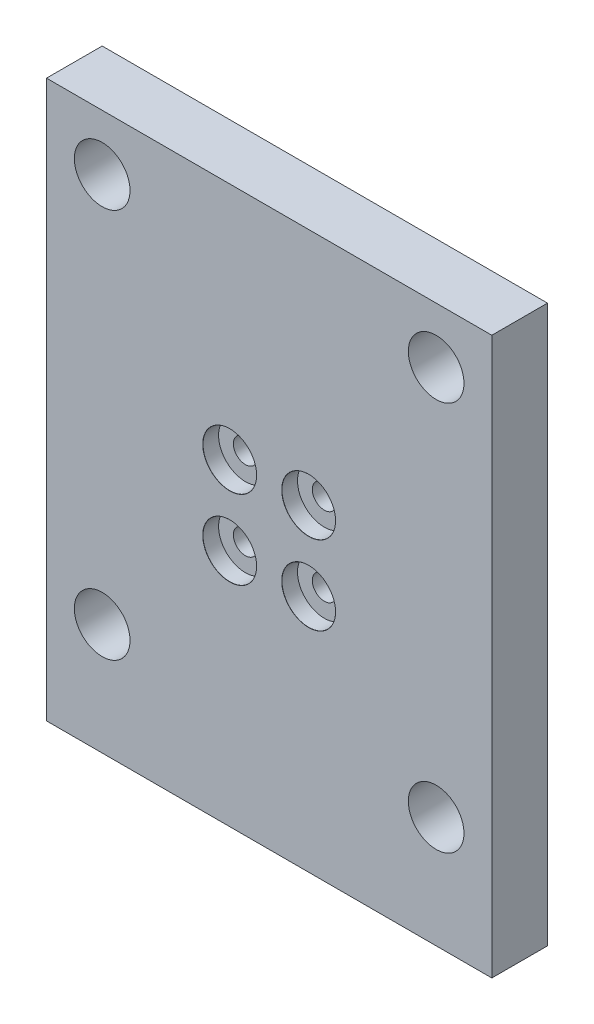
ISO-10303-21;
HEADER;
FILE_DESCRIPTION(('STEP AP214'),'2;1');
FILE_NAME('part.step','',(''),(''),'','','');
FILE_SCHEMA(('AUTOMOTIVE_DESIGN { 1 0 10303 214 1 1 1 1 }'));
ENDSEC;
DATA;
#1=APPLICATION_CONTEXT('core data for automotive mechanical design processes');
#2=APPLICATION_PROTOCOL_DEFINITION('international standard','automotive_design',2000,#1);
#3=PRODUCT_CONTEXT('',#1,'mechanical');
#4=PRODUCT('Part','Part','',(#3));
#5=PRODUCT_RELATED_PRODUCT_CATEGORY('part','',(#4));
#6=PRODUCT_DEFINITION_FORMATION('','',#4);
#7=PRODUCT_DEFINITION_CONTEXT('part definition',#1,'design');
#8=PRODUCT_DEFINITION('design','',#6,#7);
#9=PRODUCT_DEFINITION_SHAPE('','',#8);
#10=(LENGTH_UNIT() NAMED_UNIT(*) SI_UNIT(.MILLI.,.METRE.));
#11=(NAMED_UNIT(*) PLANE_ANGLE_UNIT() SI_UNIT($,.RADIAN.));
#12=(NAMED_UNIT(*) SI_UNIT($,.STERADIAN.) SOLID_ANGLE_UNIT());
#13=UNCERTAINTY_MEASURE_WITH_UNIT(LENGTH_MEASURE(1.E-05),#10,'distance_accuracy_value','');
#14=(GEOMETRIC_REPRESENTATION_CONTEXT(3) GLOBAL_UNCERTAINTY_ASSIGNED_CONTEXT((#13)) GLOBAL_UNIT_ASSIGNED_CONTEXT((#10,
#11,#12)) REPRESENTATION_CONTEXT('',''));
#15=CARTESIAN_POINT('',(0.,0.,0.));
#16=DIRECTION('',(0.,0.,1.));
#17=DIRECTION('',(1.,0.,0.));
#18=AXIS2_PLACEMENT_3D('',#15,#16,#17);
#19=CARTESIAN_POINT('',(0.,0.,12.7));
#20=DIRECTION('',(0.,0.,-1.));
#21=DIRECTION('',(-1.,0.,0.));
#22=AXIS2_PLACEMENT_3D('',#19,#20,#21);
#23=PLANE('',#22);
#24=CARTESIAN_POINT('',(41.7957,72.5,12.7));
#25=DIRECTION('',(0.,0.,1.));
#26=DIRECTION('',(1.,0.,0.));
#27=AXIS2_PLACEMENT_3D('',#24,#25,#26);
#28=CIRCLE('',#27,6.145);
#29=CARTESIAN_POINT('',(47.9407,72.5,12.7));
#30=VERTEX_POINT('',#29);
#31=EDGE_CURVE('E199',#30,#30,#28,.T.);
#32=ORIENTED_EDGE('',*,*,#31,.F.);
#33=EDGE_LOOP('',(#32));
#34=FACE_BOUND('',#33,.T.);
#35=CARTESIAN_POINT('',(59.8043,72.5,12.7));
#36=DIRECTION('',(0.,0.,1.));
#37=DIRECTION('',(1.,0.,0.));
#38=AXIS2_PLACEMENT_3D('',#35,#36,#37);
#39=CIRCLE('',#38,6.14499999999999);
#40=CARTESIAN_POINT('',(65.9493,72.5,12.7));
#41=VERTEX_POINT('',#40);
#42=EDGE_CURVE('E184',#41,#41,#39,.T.);
#43=ORIENTED_EDGE('',*,*,#42,.F.);
#44=EDGE_LOOP('',(#43));
#45=FACE_BOUND('',#44,.T.);
#46=CARTESIAN_POINT('',(41.7957,54.5,12.7));
#47=DIRECTION('',(0.,0.,1.));
#48=DIRECTION('',(1.,0.,0.));
#49=AXIS2_PLACEMENT_3D('',#46,#47,#48);
#50=CIRCLE('',#49,6.145);
#51=CARTESIAN_POINT('',(47.9407,54.5,12.7));
#52=VERTEX_POINT('',#51);
#53=EDGE_CURVE('E154',#52,#52,#50,.T.);
#54=ORIENTED_EDGE('',*,*,#53,.F.);
#55=EDGE_LOOP('',(#54));
#56=FACE_BOUND('',#55,.T.);
#57=CARTESIAN_POINT('',(88.9,114.3,12.7));
#58=DIRECTION('',(0.,0.,1.));
#59=DIRECTION('',(-1.,0.,0.));
#60=AXIS2_PLACEMENT_3D('',#57,#58,#59);
#61=CIRCLE('',#60,6.35000000000001);
#62=CARTESIAN_POINT('',(82.55,114.3,12.7));
#63=VERTEX_POINT('',#62);
#64=EDGE_CURVE('E128',#63,#63,#61,.T.);
#65=ORIENTED_EDGE('',*,*,#64,.F.);
#66=EDGE_LOOP('',(#65));
#67=FACE_BOUND('',#66,.T.);
#68=CARTESIAN_POINT('',(88.9,25.4,12.7));
#69=DIRECTION('',(0.,0.,1.));
#70=DIRECTION('',(-1.,0.,0.));
#71=AXIS2_PLACEMENT_3D('',#68,#69,#70);
#72=CIRCLE('',#71,6.35000000000001);
#73=CARTESIAN_POINT('',(82.55,25.4,12.7));
#74=VERTEX_POINT('',#73);
#75=EDGE_CURVE('E135',#74,#74,#72,.T.);
#76=ORIENTED_EDGE('',*,*,#75,.F.);
#77=EDGE_LOOP('',(#76));
#78=FACE_BOUND('',#77,.T.);
#79=CARTESIAN_POINT('',(12.7,25.4,12.7));
#80=DIRECTION('',(0.,0.,1.));
#81=DIRECTION('',(1.,0.,0.));
#82=AXIS2_PLACEMENT_3D('',#79,#80,#81);
#83=CIRCLE('',#82,6.35);
#84=CARTESIAN_POINT('',(19.05,25.4,12.7));
#85=VERTEX_POINT('',#84);
#86=EDGE_CURVE('E122',#85,#85,#83,.T.);
#87=ORIENTED_EDGE('',*,*,#86,.F.);
#88=EDGE_LOOP('',(#87));
#89=FACE_BOUND('',#88,.T.);
#90=CARTESIAN_POINT('',(12.7,114.3,12.7));
#91=DIRECTION('',(0.,0.,1.));
#92=DIRECTION('',(1.,0.,0.));
#93=AXIS2_PLACEMENT_3D('',#90,#91,#92);
#94=CIRCLE('',#93,6.35);
#95=CARTESIAN_POINT('',(19.05,114.3,12.7));
#96=VERTEX_POINT('',#95);
#97=EDGE_CURVE('E119',#96,#96,#94,.T.);
#98=ORIENTED_EDGE('',*,*,#97,.F.);
#99=EDGE_LOOP('',(#98));
#100=FACE_BOUND('',#99,.T.);
#101=DIRECTION('',(0.,-1.,0.));
#102=VECTOR('',#101,1.);
#103=CARTESIAN_POINT('',(0.,0.,12.7));
#104=LINE('',#103,#102);
#105=CARTESIAN_POINT('',(0.,127.,12.7));
#106=VERTEX_POINT('',#105);
#107=CARTESIAN_POINT('',(0.,0.,12.7));
#108=VERTEX_POINT('',#107);
#109=EDGE_CURVE('E93',#106,#108,#104,.T.);
#110=ORIENTED_EDGE('',*,*,#109,.T.);
#111=DIRECTION('',(1.,0.,0.));
#112=VECTOR('',#111,1.);
#113=CARTESIAN_POINT('',(0.,0.,12.7));
#114=LINE('',#113,#112);
#115=CARTESIAN_POINT('',(101.6,0.,12.7));
#116=VERTEX_POINT('',#115);
#117=EDGE_CURVE('E88',#108,#116,#114,.T.);
#118=ORIENTED_EDGE('',*,*,#117,.T.);
#119=DIRECTION('',(0.,1.,0.));
#120=VECTOR('',#119,1.);
#121=CARTESIAN_POINT('',(101.6,0.,12.7));
#122=LINE('',#121,#120);
#123=CARTESIAN_POINT('',(101.6,127.,12.7));
#124=VERTEX_POINT('',#123);
#125=EDGE_CURVE('E91',#116,#124,#122,.T.);
#126=ORIENTED_EDGE('',*,*,#125,.T.);
#127=DIRECTION('',(-1.,0.,0.));
#128=VECTOR('',#127,1.);
#129=CARTESIAN_POINT('',(0.,127.,12.7));
#130=LINE('',#129,#128);
#131=EDGE_CURVE('E58',#124,#106,#130,.T.);
#132=ORIENTED_EDGE('',*,*,#131,.T.);
#133=EDGE_LOOP('',(#110,#118,#126,#132));
#134=FACE_BOUND('',#133,.T.);
#135=CARTESIAN_POINT('',(59.8043,54.5,12.7));
#136=DIRECTION('',(0.,0.,1.));
#137=DIRECTION('',(1.,0.,0.));
#138=AXIS2_PLACEMENT_3D('',#135,#136,#137);
#139=CIRCLE('',#138,6.14499999999999);
#140=CARTESIAN_POINT('',(65.9493,54.5,12.7));
#141=VERTEX_POINT('',#140);
#142=EDGE_CURVE('E169',#141,#141,#139,.T.);
#143=ORIENTED_EDGE('',*,*,#142,.F.);
#144=EDGE_LOOP('',(#143));
#145=FACE_BOUND('',#144,.T.);
#146=ADVANCED_FACE('F41',(#34,#45,#56,#67,#78,#89,#100,#134,#145),#23,.F.);
#147=CARTESIAN_POINT('',(0.,0.,12.7));
#148=DIRECTION('',(1.,0.,0.));
#149=DIRECTION('',(0.,0.,-1.));
#150=AXIS2_PLACEMENT_3D('',#147,#148,#149);
#151=PLANE('',#150);
#152=DIRECTION('',(0.,-1.,0.));
#153=VECTOR('',#152,1.);
#154=CARTESIAN_POINT('',(0.,0.,0.));
#155=LINE('',#154,#153);
#156=CARTESIAN_POINT('',(0.,127.,0.));
#157=VERTEX_POINT('',#156);
#158=CARTESIAN_POINT('',(0.,0.,0.));
#159=VERTEX_POINT('',#158);
#160=EDGE_CURVE('E105',#157,#159,#155,.T.);
#161=ORIENTED_EDGE('',*,*,#160,.T.);
#162=DIRECTION('',(0.,0.,-1.));
#163=VECTOR('',#162,1.);
#164=CARTESIAN_POINT('',(0.,0.,12.7));
#165=LINE('',#164,#163);
#166=EDGE_CURVE('E11',#108,#159,#165,.T.);
#167=ORIENTED_EDGE('',*,*,#166,.F.);
#168=ORIENTED_EDGE('',*,*,#109,.F.);
#169=DIRECTION('',(0.,0.,-1.));
#170=VECTOR('',#169,1.);
#171=CARTESIAN_POINT('',(0.,127.,12.7));
#172=LINE('',#171,#170);
#173=EDGE_CURVE('E101',#106,#157,#172,.T.);
#174=ORIENTED_EDGE('',*,*,#173,.T.);
#175=EDGE_LOOP('',(#161,#167,#168,#174));
#176=FACE_BOUND('',#175,.T.);
#177=ADVANCED_FACE('F43',(#176),#151,.F.);
#178=CARTESIAN_POINT('',(0.,0.,12.7));
#179=DIRECTION('',(0.,1.,0.));
#180=DIRECTION('',(0.,0.,1.));
#181=AXIS2_PLACEMENT_3D('',#178,#179,#180);
#182=PLANE('',#181);
#183=DIRECTION('',(1.,0.,0.));
#184=VECTOR('',#183,1.);
#185=CARTESIAN_POINT('',(0.,0.,0.));
#186=LINE('',#185,#184);
#187=CARTESIAN_POINT('',(101.6,0.,0.));
#188=VERTEX_POINT('',#187);
#189=EDGE_CURVE('E97',#159,#188,#186,.T.);
#190=ORIENTED_EDGE('',*,*,#189,.T.);
#191=DIRECTION('',(0.,0.,-1.));
#192=VECTOR('',#191,1.);
#193=CARTESIAN_POINT('',(101.6,0.,12.7));
#194=LINE('',#193,#192);
#195=EDGE_CURVE('E50',#116,#188,#194,.T.);
#196=ORIENTED_EDGE('',*,*,#195,.F.);
#197=ORIENTED_EDGE('',*,*,#117,.F.);
#198=ORIENTED_EDGE('',*,*,#166,.T.);
#199=EDGE_LOOP('',(#190,#196,#197,#198));
#200=FACE_BOUND('',#199,.T.);
#201=ADVANCED_FACE('F96',(#200),#182,.F.);
#202=CARTESIAN_POINT('',(101.6,0.,12.7));
#203=DIRECTION('',(-1.,0.,0.));
#204=DIRECTION('',(0.,0.,1.));
#205=AXIS2_PLACEMENT_3D('',#202,#203,#204);
#206=PLANE('',#205);
#207=DIRECTION('',(0.,1.,0.));
#208=VECTOR('',#207,1.);
#209=CARTESIAN_POINT('',(101.6,0.,0.));
#210=LINE('',#209,#208);
#211=CARTESIAN_POINT('',(101.6,127.,0.));
#212=VERTEX_POINT('',#211);
#213=EDGE_CURVE('E75',#188,#212,#210,.T.);
#214=ORIENTED_EDGE('',*,*,#213,.T.);
#215=DIRECTION('',(0.,0.,-1.));
#216=VECTOR('',#215,1.);
#217=CARTESIAN_POINT('',(101.6,127.,12.7));
#218=LINE('',#217,#216);
#219=EDGE_CURVE('E98',#124,#212,#218,.T.);
#220=ORIENTED_EDGE('',*,*,#219,.F.);
#221=ORIENTED_EDGE('',*,*,#125,.F.);
#222=ORIENTED_EDGE('',*,*,#195,.T.);
#223=EDGE_LOOP('',(#214,#220,#221,#222));
#224=FACE_BOUND('',#223,.T.);
#225=ADVANCED_FACE('F99',(#224),#206,.F.);
#226=CARTESIAN_POINT('',(0.,127.,12.7));
#227=DIRECTION('',(0.,-1.,0.));
#228=DIRECTION('',(0.,0.,-1.));
#229=AXIS2_PLACEMENT_3D('',#226,#227,#228);
#230=PLANE('',#229);
#231=DIRECTION('',(-1.,0.,0.));
#232=VECTOR('',#231,1.);
#233=CARTESIAN_POINT('',(0.,127.,0.));
#234=LINE('',#233,#232);
#235=EDGE_CURVE('E81',#212,#157,#234,.T.);
#236=ORIENTED_EDGE('',*,*,#235,.T.);
#237=ORIENTED_EDGE('',*,*,#173,.F.);
#238=ORIENTED_EDGE('',*,*,#131,.F.);
#239=ORIENTED_EDGE('',*,*,#219,.T.);
#240=EDGE_LOOP('',(#236,#237,#238,#239));
#241=FACE_BOUND('',#240,.T.);
#242=ADVANCED_FACE('F113',(#241),#230,.F.);
#243=CARTESIAN_POINT('',(0.,0.,0.));
#244=DIRECTION('',(0.,0.,-1.));
#245=DIRECTION('',(-1.,0.,0.));
#246=AXIS2_PLACEMENT_3D('',#243,#244,#245);
#247=PLANE('',#246);
#248=CARTESIAN_POINT('',(41.7957,72.5,0.));
#249=DIRECTION('',(0.,0.,-1.));
#250=DIRECTION('',(-1.,0.,0.));
#251=AXIS2_PLACEMENT_3D('',#248,#249,#250);
#252=CIRCLE('',#251,2.75);
#253=CARTESIAN_POINT('',(39.0457,72.5,0.));
#254=VERTEX_POINT('',#253);
#255=EDGE_CURVE('E187',#254,#254,#252,.T.);
#256=ORIENTED_EDGE('',*,*,#255,.F.);
#257=EDGE_LOOP('',(#256));
#258=FACE_BOUND('',#257,.T.);
#259=CARTESIAN_POINT('',(59.8043,72.5,0.));
#260=DIRECTION('',(0.,0.,-1.));
#261=DIRECTION('',(-1.,0.,0.));
#262=AXIS2_PLACEMENT_3D('',#259,#260,#261);
#263=CIRCLE('',#262,2.75);
#264=CARTESIAN_POINT('',(57.0543,72.5,0.));
#265=VERTEX_POINT('',#264);
#266=EDGE_CURVE('E172',#265,#265,#263,.T.);
#267=ORIENTED_EDGE('',*,*,#266,.F.);
#268=EDGE_LOOP('',(#267));
#269=FACE_BOUND('',#268,.T.);
#270=CARTESIAN_POINT('',(59.8043,54.5,0.));
#271=DIRECTION('',(0.,0.,-1.));
#272=DIRECTION('',(-1.,0.,0.));
#273=AXIS2_PLACEMENT_3D('',#270,#271,#272);
#274=CIRCLE('',#273,2.75);
#275=CARTESIAN_POINT('',(57.0543,54.5,0.));
#276=VERTEX_POINT('',#275);
#277=EDGE_CURVE('E157',#276,#276,#274,.T.);
#278=ORIENTED_EDGE('',*,*,#277,.F.);
#279=EDGE_LOOP('',(#278));
#280=FACE_BOUND('',#279,.T.);
#281=CARTESIAN_POINT('',(41.7957,54.5,0.));
#282=DIRECTION('',(0.,0.,-1.));
#283=DIRECTION('',(-1.,0.,0.));
#284=AXIS2_PLACEMENT_3D('',#281,#282,#283);
#285=CIRCLE('',#284,2.75);
#286=CARTESIAN_POINT('',(39.0457,54.5,0.));
#287=VERTEX_POINT('',#286);
#288=EDGE_CURVE('E129',#287,#287,#285,.T.);
#289=ORIENTED_EDGE('',*,*,#288,.F.);
#290=EDGE_LOOP('',(#289));
#291=FACE_BOUND('',#290,.T.);
#292=CARTESIAN_POINT('',(88.9,114.3,0.));
#293=DIRECTION('',(0.,0.,1.));
#294=DIRECTION('',(-1.,0.,0.));
#295=AXIS2_PLACEMENT_3D('',#292,#293,#294);
#296=CIRCLE('',#295,6.35000000000001);
#297=CARTESIAN_POINT('',(82.55,114.3,0.));
#298=VERTEX_POINT('',#297);
#299=EDGE_CURVE('E125',#298,#298,#296,.T.);
#300=ORIENTED_EDGE('',*,*,#299,.T.);
#301=EDGE_LOOP('',(#300));
#302=FACE_BOUND('',#301,.T.);
#303=CARTESIAN_POINT('',(88.9,25.4,0.));
#304=DIRECTION('',(0.,0.,1.));
#305=DIRECTION('',(-1.,0.,0.));
#306=AXIS2_PLACEMENT_3D('',#303,#304,#305);
#307=CIRCLE('',#306,6.35000000000001);
#308=CARTESIAN_POINT('',(82.55,25.4,0.));
#309=VERTEX_POINT('',#308);
#310=EDGE_CURVE('E132',#309,#309,#307,.T.);
#311=ORIENTED_EDGE('',*,*,#310,.T.);
#312=EDGE_LOOP('',(#311));
#313=FACE_BOUND('',#312,.T.);
#314=CARTESIAN_POINT('',(12.7,25.4,0.));
#315=DIRECTION('',(0.,0.,1.));
#316=DIRECTION('',(1.,0.,0.));
#317=AXIS2_PLACEMENT_3D('',#314,#315,#316);
#318=CIRCLE('',#317,6.35);
#319=CARTESIAN_POINT('',(19.05,25.4,0.));
#320=VERTEX_POINT('',#319);
#321=EDGE_CURVE('E138',#320,#320,#318,.T.);
#322=ORIENTED_EDGE('',*,*,#321,.T.);
#323=EDGE_LOOP('',(#322));
#324=FACE_BOUND('',#323,.T.);
#325=CARTESIAN_POINT('',(12.7,114.3,0.));
#326=DIRECTION('',(0.,0.,1.));
#327=DIRECTION('',(1.,0.,0.));
#328=AXIS2_PLACEMENT_3D('',#325,#326,#327);
#329=CIRCLE('',#328,6.35);
#330=CARTESIAN_POINT('',(19.05,114.3,0.));
#331=VERTEX_POINT('',#330);
#332=EDGE_CURVE('E108',#331,#331,#329,.T.);
#333=ORIENTED_EDGE('',*,*,#332,.T.);
#334=EDGE_LOOP('',(#333));
#335=FACE_BOUND('',#334,.T.);
#336=ORIENTED_EDGE('',*,*,#160,.F.);
#337=ORIENTED_EDGE('',*,*,#235,.F.);
#338=ORIENTED_EDGE('',*,*,#213,.F.);
#339=ORIENTED_EDGE('',*,*,#189,.F.);
#340=EDGE_LOOP('',(#336,#337,#338,#339));
#341=FACE_BOUND('',#340,.T.);
#342=ADVANCED_FACE('F116',(#258,#269,#280,#291,#302,#313,#324,#335,#341),#247,.T.);
#343=CARTESIAN_POINT('',(12.7,114.3,0.));
#344=DIRECTION('',(0.,0.,1.));
#345=DIRECTION('',(1.,0.,0.));
#346=AXIS2_PLACEMENT_3D('',#343,#344,#345);
#347=CYLINDRICAL_SURFACE('',#346,6.35);
#348=ORIENTED_EDGE('',*,*,#332,.F.);
#349=EDGE_LOOP('',(#348));
#350=FACE_BOUND('',#349,.T.);
#351=ORIENTED_EDGE('',*,*,#97,.T.);
#352=EDGE_LOOP('',(#351));
#353=FACE_BOUND('',#352,.T.);
#354=ADVANCED_FACE('F220',(#350,#353),#347,.F.);
#355=CARTESIAN_POINT('',(12.7,25.4,0.));
#356=DIRECTION('',(0.,0.,1.));
#357=DIRECTION('',(1.,0.,0.));
#358=AXIS2_PLACEMENT_3D('',#355,#356,#357);
#359=CYLINDRICAL_SURFACE('',#358,6.35);
#360=ORIENTED_EDGE('',*,*,#321,.F.);
#361=EDGE_LOOP('',(#360));
#362=FACE_BOUND('',#361,.T.);
#363=ORIENTED_EDGE('',*,*,#86,.T.);
#364=EDGE_LOOP('',(#363));
#365=FACE_BOUND('',#364,.T.);
#366=ADVANCED_FACE('F222',(#362,#365),#359,.F.);
#367=CARTESIAN_POINT('',(88.9,25.4,0.));
#368=DIRECTION('',(0.,0.,1.));
#369=DIRECTION('',(1.,0.,0.));
#370=AXIS2_PLACEMENT_3D('',#367,#368,#369);
#371=CYLINDRICAL_SURFACE('',#370,6.35000000000001);
#372=ORIENTED_EDGE('',*,*,#310,.F.);
#373=EDGE_LOOP('',(#372));
#374=FACE_BOUND('',#373,.T.);
#375=ORIENTED_EDGE('',*,*,#75,.T.);
#376=EDGE_LOOP('',(#375));
#377=FACE_BOUND('',#376,.T.);
#378=ADVANCED_FACE('F229',(#374,#377),#371,.F.);
#379=CARTESIAN_POINT('',(88.9,114.3,0.));
#380=DIRECTION('',(0.,0.,1.));
#381=DIRECTION('',(1.,0.,0.));
#382=AXIS2_PLACEMENT_3D('',#379,#380,#381);
#383=CYLINDRICAL_SURFACE('',#382,6.35000000000001);
#384=ORIENTED_EDGE('',*,*,#299,.F.);
#385=EDGE_LOOP('',(#384));
#386=FACE_BOUND('',#385,.T.);
#387=ORIENTED_EDGE('',*,*,#64,.T.);
#388=EDGE_LOOP('',(#387));
#389=FACE_BOUND('',#388,.T.);
#390=ADVANCED_FACE('F236',(#386,#389),#383,.F.);
#391=CARTESIAN_POINT('',(41.7957,54.5,12.7));
#392=DIRECTION('',(0.,0.,1.));
#393=DIRECTION('',(1.,0.,0.));
#394=AXIS2_PLACEMENT_3D('',#391,#392,#393);
#395=CYLINDRICAL_SURFACE('',#394,2.75);
#396=CARTESIAN_POINT('',(41.7957,54.5,9.12));
#397=DIRECTION('',(0.,0.,1.));
#398=DIRECTION('',(1.,0.,0.));
#399=AXIS2_PLACEMENT_3D('',#396,#397,#398);
#400=CIRCLE('',#399,2.75);
#401=CARTESIAN_POINT('',(44.5457,54.5,9.12));
#402=VERTEX_POINT('',#401);
#403=EDGE_CURVE('E145',#402,#402,#400,.T.);
#404=ORIENTED_EDGE('',*,*,#403,.T.);
#405=EDGE_LOOP('',(#404));
#406=FACE_BOUND('',#405,.T.);
#407=ORIENTED_EDGE('',*,*,#288,.T.);
#408=EDGE_LOOP('',(#407));
#409=FACE_BOUND('',#408,.T.);
#410=ADVANCED_FACE('F273',(#406,#409),#395,.F.);
#411=CARTESIAN_POINT('',(47.9157,54.5,9.12));
#412=DIRECTION('',(0.,0.,-1.));
#413=DIRECTION('',(-1.,0.,0.));
#414=AXIS2_PLACEMENT_3D('',#411,#412,#413);
#415=PLANE('',#414);
#416=ORIENTED_EDGE('',*,*,#403,.F.);
#417=EDGE_LOOP('',(#416));
#418=FACE_BOUND('',#417,.T.);
#419=CARTESIAN_POINT('',(41.7957,54.5,9.12));
#420=DIRECTION('',(0.,0.,1.));
#421=DIRECTION('',(1.,0.,0.));
#422=AXIS2_PLACEMENT_3D('',#419,#420,#421);
#423=CIRCLE('',#422,6.12);
#424=CARTESIAN_POINT('',(47.9157,54.5,9.12));
#425=VERTEX_POINT('',#424);
#426=EDGE_CURVE('E148',#425,#425,#423,.T.);
#427=ORIENTED_EDGE('',*,*,#426,.T.);
#428=EDGE_LOOP('',(#427));
#429=FACE_BOUND('',#428,.T.);
#430=ADVANCED_FACE('F278',(#418,#429),#415,.F.);
#431=CARTESIAN_POINT('',(41.7957,54.5,12.7));
#432=DIRECTION('',(0.,0.,1.));
#433=DIRECTION('',(1.,0.,0.));
#434=AXIS2_PLACEMENT_3D('',#431,#432,#433);
#435=CYLINDRICAL_SURFACE('',#434,6.12);
#436=ORIENTED_EDGE('',*,*,#426,.F.);
#437=EDGE_LOOP('',(#436));
#438=FACE_BOUND('',#437,.T.);
#439=CARTESIAN_POINT('',(41.7957,54.5,12.675));
#440=DIRECTION('',(0.,0.,1.));
#441=DIRECTION('',(1.,0.,0.));
#442=AXIS2_PLACEMENT_3D('',#439,#440,#441);
#443=CIRCLE('',#442,6.12);
#444=CARTESIAN_POINT('',(47.9157,54.5,12.675));
#445=VERTEX_POINT('',#444);
#446=EDGE_CURVE('E151',#445,#445,#443,.T.);
#447=ORIENTED_EDGE('',*,*,#446,.T.);
#448=EDGE_LOOP('',(#447));
#449=FACE_BOUND('',#448,.T.);
#450=ADVANCED_FACE('F288',(#438,#449),#435,.F.);
#451=CARTESIAN_POINT('',(41.7957,54.5,12.7));
#452=DIRECTION('',(0.,0.,1.));
#453=DIRECTION('',(1.,0.,0.));
#454=AXIS2_PLACEMENT_3D('',#451,#452,#453);
#455=CONICAL_SURFACE('',#454,6.145,0.78539816339731);
#456=ORIENTED_EDGE('',*,*,#446,.F.);
#457=EDGE_LOOP('',(#456));
#458=FACE_BOUND('',#457,.T.);
#459=ORIENTED_EDGE('',*,*,#53,.T.);
#460=EDGE_LOOP('',(#459));
#461=FACE_BOUND('',#460,.T.);
#462=ADVANCED_FACE('F299',(#458,#461),#455,.F.);
#463=CARTESIAN_POINT('',(59.8043,54.5,12.7));
#464=DIRECTION('',(0.,0.,1.));
#465=DIRECTION('',(1.,0.,0.));
#466=AXIS2_PLACEMENT_3D('',#463,#464,#465);
#467=CYLINDRICAL_SURFACE('',#466,2.75);
#468=CARTESIAN_POINT('',(59.8043,54.5,9.12));
#469=DIRECTION('',(0.,0.,1.));
#470=DIRECTION('',(1.,0.,0.));
#471=AXIS2_PLACEMENT_3D('',#468,#469,#470);
#472=CIRCLE('',#471,2.75);
#473=CARTESIAN_POINT('',(62.5543,54.5,9.12));
#474=VERTEX_POINT('',#473);
#475=EDGE_CURVE('E160',#474,#474,#472,.T.);
#476=ORIENTED_EDGE('',*,*,#475,.T.);
#477=EDGE_LOOP('',(#476));
#478=FACE_BOUND('',#477,.T.);
#479=ORIENTED_EDGE('',*,*,#277,.T.);
#480=EDGE_LOOP('',(#479));
#481=FACE_BOUND('',#480,.T.);
#482=ADVANCED_FACE('F310',(#478,#481),#467,.F.);
#483=CARTESIAN_POINT('',(65.9243,54.5,9.12));
#484=DIRECTION('',(0.,0.,-1.));
#485=DIRECTION('',(-1.,0.,0.));
#486=AXIS2_PLACEMENT_3D('',#483,#484,#485);
#487=PLANE('',#486);
#488=ORIENTED_EDGE('',*,*,#475,.F.);
#489=EDGE_LOOP('',(#488));
#490=FACE_BOUND('',#489,.T.);
#491=CARTESIAN_POINT('',(59.8043,54.5,9.12));
#492=DIRECTION('',(0.,0.,1.));
#493=DIRECTION('',(1.,0.,0.));
#494=AXIS2_PLACEMENT_3D('',#491,#492,#493);
#495=CIRCLE('',#494,6.11999999999999);
#496=CARTESIAN_POINT('',(65.9243,54.5,9.12));
#497=VERTEX_POINT('',#496);
#498=EDGE_CURVE('E163',#497,#497,#495,.T.);
#499=ORIENTED_EDGE('',*,*,#498,.T.);
#500=EDGE_LOOP('',(#499));
#501=FACE_BOUND('',#500,.T.);
#502=ADVANCED_FACE('F321',(#490,#501),#487,.F.);
#503=CARTESIAN_POINT('',(59.8043,54.5,12.7));
#504=DIRECTION('',(0.,0.,1.));
#505=DIRECTION('',(1.,0.,0.));
#506=AXIS2_PLACEMENT_3D('',#503,#504,#505);
#507=CYLINDRICAL_SURFACE('',#506,6.11999999999999);
#508=ORIENTED_EDGE('',*,*,#498,.F.);
#509=EDGE_LOOP('',(#508));
#510=FACE_BOUND('',#509,.T.);
#511=CARTESIAN_POINT('',(59.8043,54.5,12.675));
#512=DIRECTION('',(0.,0.,1.));
#513=DIRECTION('',(1.,0.,0.));
#514=AXIS2_PLACEMENT_3D('',#511,#512,#513);
#515=CIRCLE('',#514,6.11999999999999);
#516=CARTESIAN_POINT('',(65.9243,54.5,12.675));
#517=VERTEX_POINT('',#516);
#518=EDGE_CURVE('E166',#517,#517,#515,.T.);
#519=ORIENTED_EDGE('',*,*,#518,.T.);
#520=EDGE_LOOP('',(#519));
#521=FACE_BOUND('',#520,.T.);
#522=ADVANCED_FACE('F332',(#510,#521),#507,.F.);
#523=CARTESIAN_POINT('',(59.8043,54.5,12.7));
#524=DIRECTION('',(0.,0.,1.));
#525=DIRECTION('',(1.,0.,0.));
#526=AXIS2_PLACEMENT_3D('',#523,#524,#525);
#527=CONICAL_SURFACE('',#526,6.14499999999999,0.78539816339731);
#528=ORIENTED_EDGE('',*,*,#518,.F.);
#529=EDGE_LOOP('',(#528));
#530=FACE_BOUND('',#529,.T.);
#531=ORIENTED_EDGE('',*,*,#142,.T.);
#532=EDGE_LOOP('',(#531));
#533=FACE_BOUND('',#532,.T.);
#534=ADVANCED_FACE('F343',(#530,#533),#527,.F.);
#535=CARTESIAN_POINT('',(59.8043,72.5,12.7));
#536=DIRECTION('',(0.,0.,1.));
#537=DIRECTION('',(1.,0.,0.));
#538=AXIS2_PLACEMENT_3D('',#535,#536,#537);
#539=CYLINDRICAL_SURFACE('',#538,2.75);
#540=CARTESIAN_POINT('',(59.8043,72.5,9.12));
#541=DIRECTION('',(0.,0.,1.));
#542=DIRECTION('',(1.,0.,0.));
#543=AXIS2_PLACEMENT_3D('',#540,#541,#542);
#544=CIRCLE('',#543,2.75);
#545=CARTESIAN_POINT('',(62.5543,72.5,9.12));
#546=VERTEX_POINT('',#545);
#547=EDGE_CURVE('E175',#546,#546,#544,.T.);
#548=ORIENTED_EDGE('',*,*,#547,.T.);
#549=EDGE_LOOP('',(#548));
#550=FACE_BOUND('',#549,.T.);
#551=ORIENTED_EDGE('',*,*,#266,.T.);
#552=EDGE_LOOP('',(#551));
#553=FACE_BOUND('',#552,.T.);
#554=ADVANCED_FACE('F354',(#550,#553),#539,.F.);
#555=CARTESIAN_POINT('',(65.9243,72.5,9.12));
#556=DIRECTION('',(0.,0.,-1.));
#557=DIRECTION('',(-1.,0.,0.));
#558=AXIS2_PLACEMENT_3D('',#555,#556,#557);
#559=PLANE('',#558);
#560=ORIENTED_EDGE('',*,*,#547,.F.);
#561=EDGE_LOOP('',(#560));
#562=FACE_BOUND('',#561,.T.);
#563=CARTESIAN_POINT('',(59.8043,72.5,9.12));
#564=DIRECTION('',(0.,0.,1.));
#565=DIRECTION('',(1.,0.,0.));
#566=AXIS2_PLACEMENT_3D('',#563,#564,#565);
#567=CIRCLE('',#566,6.11999999999999);
#568=CARTESIAN_POINT('',(65.9243,72.5,9.12));
#569=VERTEX_POINT('',#568);
#570=EDGE_CURVE('E178',#569,#569,#567,.T.);
#571=ORIENTED_EDGE('',*,*,#570,.T.);
#572=EDGE_LOOP('',(#571));
#573=FACE_BOUND('',#572,.T.);
#574=ADVANCED_FACE('F365',(#562,#573),#559,.F.);
#575=CARTESIAN_POINT('',(59.8043,72.5,12.7));
#576=DIRECTION('',(0.,0.,1.));
#577=DIRECTION('',(1.,0.,0.));
#578=AXIS2_PLACEMENT_3D('',#575,#576,#577);
#579=CYLINDRICAL_SURFACE('',#578,6.11999999999999);
#580=ORIENTED_EDGE('',*,*,#570,.F.);
#581=EDGE_LOOP('',(#580));
#582=FACE_BOUND('',#581,.T.);
#583=CARTESIAN_POINT('',(59.8043,72.5,12.675));
#584=DIRECTION('',(0.,0.,1.));
#585=DIRECTION('',(1.,0.,0.));
#586=AXIS2_PLACEMENT_3D('',#583,#584,#585);
#587=CIRCLE('',#586,6.11999999999999);
#588=CARTESIAN_POINT('',(65.9243,72.5,12.675));
#589=VERTEX_POINT('',#588);
#590=EDGE_CURVE('E181',#589,#589,#587,.T.);
#591=ORIENTED_EDGE('',*,*,#590,.T.);
#592=EDGE_LOOP('',(#591));
#593=FACE_BOUND('',#592,.T.);
#594=ADVANCED_FACE('F376',(#582,#593),#579,.F.);
#595=CARTESIAN_POINT('',(59.8043,72.5,12.7));
#596=DIRECTION('',(0.,0.,1.));
#597=DIRECTION('',(1.,0.,0.));
#598=AXIS2_PLACEMENT_3D('',#595,#596,#597);
#599=CONICAL_SURFACE('',#598,6.14499999999999,0.78539816339731);
#600=ORIENTED_EDGE('',*,*,#590,.F.);
#601=EDGE_LOOP('',(#600));
#602=FACE_BOUND('',#601,.T.);
#603=ORIENTED_EDGE('',*,*,#42,.T.);
#604=EDGE_LOOP('',(#603));
#605=FACE_BOUND('',#604,.T.);
#606=ADVANCED_FACE('F387',(#602,#605),#599,.F.);
#607=CARTESIAN_POINT('',(41.7957,72.5,12.7));
#608=DIRECTION('',(0.,0.,1.));
#609=DIRECTION('',(1.,0.,0.));
#610=AXIS2_PLACEMENT_3D('',#607,#608,#609);
#611=CYLINDRICAL_SURFACE('',#610,2.75);
#612=CARTESIAN_POINT('',(41.7957,72.5,9.12));
#613=DIRECTION('',(0.,0.,1.));
#614=DIRECTION('',(1.,0.,0.));
#615=AXIS2_PLACEMENT_3D('',#612,#613,#614);
#616=CIRCLE('',#615,2.75);
#617=CARTESIAN_POINT('',(44.5457,72.5,9.12));
#618=VERTEX_POINT('',#617);
#619=EDGE_CURVE('E190',#618,#618,#616,.T.);
#620=ORIENTED_EDGE('',*,*,#619,.T.);
#621=EDGE_LOOP('',(#620));
#622=FACE_BOUND('',#621,.T.);
#623=ORIENTED_EDGE('',*,*,#255,.T.);
#624=EDGE_LOOP('',(#623));
#625=FACE_BOUND('',#624,.T.);
#626=ADVANCED_FACE('F398',(#622,#625),#611,.F.);
#627=CARTESIAN_POINT('',(47.9157,72.5,9.12));
#628=DIRECTION('',(0.,0.,-1.));
#629=DIRECTION('',(-1.,0.,0.));
#630=AXIS2_PLACEMENT_3D('',#627,#628,#629);
#631=PLANE('',#630);
#632=ORIENTED_EDGE('',*,*,#619,.F.);
#633=EDGE_LOOP('',(#632));
#634=FACE_BOUND('',#633,.T.);
#635=CARTESIAN_POINT('',(41.7957,72.5,9.12));
#636=DIRECTION('',(0.,0.,1.));
#637=DIRECTION('',(1.,0.,0.));
#638=AXIS2_PLACEMENT_3D('',#635,#636,#637);
#639=CIRCLE('',#638,6.12);
#640=CARTESIAN_POINT('',(47.9157,72.5,9.12));
#641=VERTEX_POINT('',#640);
#642=EDGE_CURVE('E193',#641,#641,#639,.T.);
#643=ORIENTED_EDGE('',*,*,#642,.T.);
#644=EDGE_LOOP('',(#643));
#645=FACE_BOUND('',#644,.T.);
#646=ADVANCED_FACE('F409',(#634,#645),#631,.F.);
#647=CARTESIAN_POINT('',(41.7957,72.5,12.7));
#648=DIRECTION('',(0.,0.,1.));
#649=DIRECTION('',(1.,0.,0.));
#650=AXIS2_PLACEMENT_3D('',#647,#648,#649);
#651=CYLINDRICAL_SURFACE('',#650,6.12);
#652=ORIENTED_EDGE('',*,*,#642,.F.);
#653=EDGE_LOOP('',(#652));
#654=FACE_BOUND('',#653,.T.);
#655=CARTESIAN_POINT('',(41.7957,72.5,12.675));
#656=DIRECTION('',(0.,0.,1.));
#657=DIRECTION('',(1.,0.,0.));
#658=AXIS2_PLACEMENT_3D('',#655,#656,#657);
#659=CIRCLE('',#658,6.12);
#660=CARTESIAN_POINT('',(47.9157,72.5,12.675));
#661=VERTEX_POINT('',#660);
#662=EDGE_CURVE('E196',#661,#661,#659,.T.);
#663=ORIENTED_EDGE('',*,*,#662,.T.);
#664=EDGE_LOOP('',(#663));
#665=FACE_BOUND('',#664,.T.);
#666=ADVANCED_FACE('F420',(#654,#665),#651,.F.);
#667=CARTESIAN_POINT('',(41.7957,72.5,12.7));
#668=DIRECTION('',(0.,0.,1.));
#669=DIRECTION('',(1.,0.,0.));
#670=AXIS2_PLACEMENT_3D('',#667,#668,#669);
#671=CONICAL_SURFACE('',#670,6.145,0.78539816339731);
#672=ORIENTED_EDGE('',*,*,#662,.F.);
#673=EDGE_LOOP('',(#672));
#674=FACE_BOUND('',#673,.T.);
#675=ORIENTED_EDGE('',*,*,#31,.T.);
#676=EDGE_LOOP('',(#675));
#677=FACE_BOUND('',#676,.T.);
#678=ADVANCED_FACE('F203',(#674,#677),#671,.F.);
#679=CLOSED_SHELL('',(#146,#177,#201,#225,#242,#342,#354,#366,#378,#390,#410,#430,#450,#462,
#482,#502,#522,#534,#554,#574,#594,#606,#626,#646,#666,#678));
#680=MANIFOLD_SOLID_BREP('B2',#679);
#681=ADVANCED_BREP_SHAPE_REPRESENTATION('',(#18,#680),#14);
#682=SHAPE_DEFINITION_REPRESENTATION(#9,#681);
ENDSEC;
END-ISO-10303-21;
